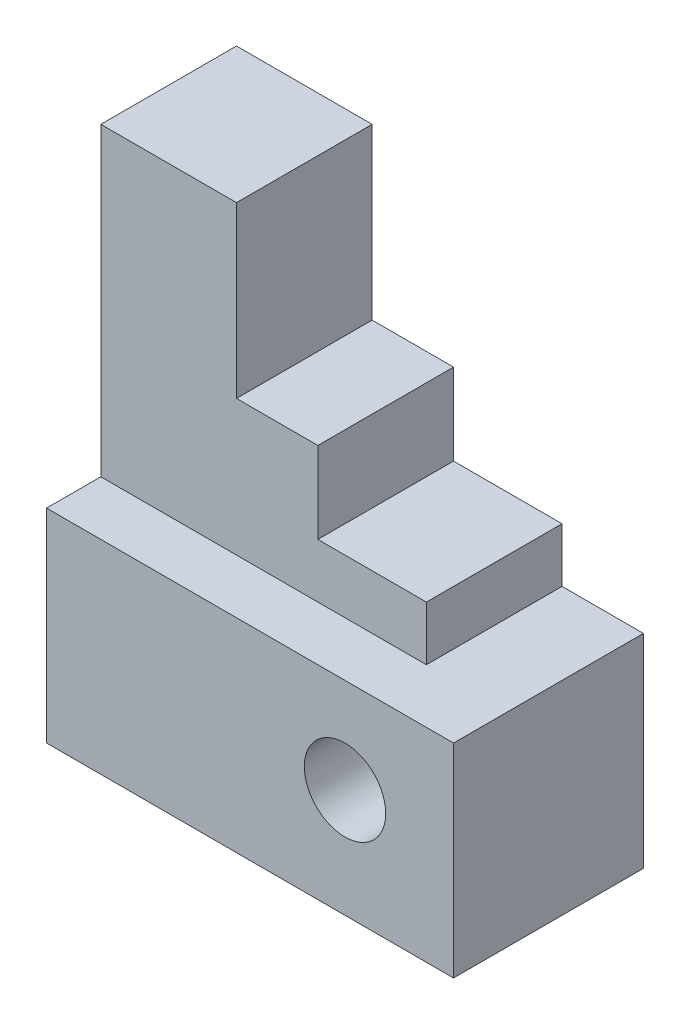
ISO-10303-21;
HEADER;
FILE_DESCRIPTION(('STEP AP214'),'2;1');
FILE_NAME('part.step','',(''),(''),'','','');
FILE_SCHEMA(('AUTOMOTIVE_DESIGN { 1 0 10303 214 1 1 1 1 }'));
ENDSEC;
DATA;
#1=APPLICATION_CONTEXT('core data for automotive mechanical design processes');
#2=APPLICATION_PROTOCOL_DEFINITION('international standard','automotive_design',2000,#1);
#3=PRODUCT_CONTEXT('',#1,'mechanical');
#4=PRODUCT('Part','Part','',(#3));
#5=PRODUCT_RELATED_PRODUCT_CATEGORY('part','',(#4));
#6=PRODUCT_DEFINITION_FORMATION('','',#4);
#7=PRODUCT_DEFINITION_CONTEXT('part definition',#1,'design');
#8=PRODUCT_DEFINITION('design','',#6,#7);
#9=PRODUCT_DEFINITION_SHAPE('','',#8);
#10=(LENGTH_UNIT() NAMED_UNIT(*) SI_UNIT(.MILLI.,.METRE.));
#11=(NAMED_UNIT(*) PLANE_ANGLE_UNIT() SI_UNIT($,.RADIAN.));
#12=(NAMED_UNIT(*) SI_UNIT($,.STERADIAN.) SOLID_ANGLE_UNIT());
#13=UNCERTAINTY_MEASURE_WITH_UNIT(LENGTH_MEASURE(1.E-05),#10,'distance_accuracy_value','');
#14=(GEOMETRIC_REPRESENTATION_CONTEXT(3) GLOBAL_UNCERTAINTY_ASSIGNED_CONTEXT((#13)) GLOBAL_UNIT_ASSIGNED_CONTEXT((#10,
#11,#12)) REPRESENTATION_CONTEXT('',''));
#15=CARTESIAN_POINT('',(0.,0.,0.));
#16=DIRECTION('',(0.,0.,1.));
#17=DIRECTION('',(1.,0.,0.));
#18=AXIS2_PLACEMENT_3D('',#15,#16,#17);
#19=CARTESIAN_POINT('',(0.,0.,14.));
#20=DIRECTION('',(0.,0.,-1.));
#21=DIRECTION('',(-1.,0.,0.));
#22=AXIS2_PLACEMENT_3D('',#19,#20,#21);
#23=PLANE('',#22);
#24=CARTESIAN_POINT('',(44.,16.,14.));
#25=DIRECTION('',(0.,0.,1.));
#26=DIRECTION('',(1.,0.,0.));
#27=AXIS2_PLACEMENT_3D('',#24,#25,#26);
#28=CIRCLE('',#27,6.);
#29=CARTESIAN_POINT('',(50.,16.,14.));
#30=VERTEX_POINT('',#29);
#31=EDGE_CURVE('E184',#30,#30,#28,.T.);
#32=ORIENTED_EDGE('',*,*,#31,.F.);
#33=EDGE_LOOP('',(#32));
#34=FACE_BOUND('',#33,.T.);
#35=DIRECTION('',(1.,0.,0.));
#36=VECTOR('',#35,1.);
#37=CARTESIAN_POINT('',(0.,30.,14.));
#38=LINE('',#37,#36);
#39=CARTESIAN_POINT('',(0.,30.,14.));
#40=VERTEX_POINT('',#39);
#41=CARTESIAN_POINT('',(60.,30.,14.));
#42=VERTEX_POINT('',#41);
#43=EDGE_CURVE('E183',#40,#42,#38,.T.);
#44=ORIENTED_EDGE('',*,*,#43,.F.);
#45=DIRECTION('',(0.,-1.,0.));
#46=VECTOR('',#45,1.);
#47=CARTESIAN_POINT('',(0.,0.,14.));
#48=LINE('',#47,#46);
#49=CARTESIAN_POINT('',(0.,0.,14.));
#50=VERTEX_POINT('',#49);
#51=EDGE_CURVE('E164',#40,#50,#48,.T.);
#52=ORIENTED_EDGE('',*,*,#51,.T.);
#53=DIRECTION('',(1.,0.,0.));
#54=VECTOR('',#53,1.);
#55=CARTESIAN_POINT('',(0.,0.,14.));
#56=LINE('',#55,#54);
#57=CARTESIAN_POINT('',(60.,0.,14.));
#58=VERTEX_POINT('',#57);
#59=EDGE_CURVE('E153',#50,#58,#56,.T.);
#60=ORIENTED_EDGE('',*,*,#59,.T.);
#61=DIRECTION('',(0.,1.,0.));
#62=VECTOR('',#61,1.);
#63=CARTESIAN_POINT('',(60.,0.,14.));
#64=LINE('',#63,#62);
#65=EDGE_CURVE('E147',#58,#42,#64,.T.);
#66=ORIENTED_EDGE('',*,*,#65,.T.);
#67=EDGE_LOOP('',(#44,#52,#60,#66));
#68=FACE_BOUND('',#67,.T.);
#69=ADVANCED_FACE('F45',(#34,#68),#23,.F.);
#70=CARTESIAN_POINT('',(0.,0.,14.));
#71=DIRECTION('',(1.,0.,0.));
#72=DIRECTION('',(0.,0.,-1.));
#73=AXIS2_PLACEMENT_3D('',#70,#71,#72);
#74=PLANE('',#73);
#75=DIRECTION('',(0.,0.,1.));
#76=VECTOR('',#75,1.);
#77=CARTESIAN_POINT('',(0.,30.,14.));
#78=LINE('',#77,#76);
#79=CARTESIAN_POINT('',(0.,30.,6.));
#80=VERTEX_POINT('',#79);
#81=EDGE_CURVE('E142',#80,#40,#78,.T.);
#82=ORIENTED_EDGE('',*,*,#81,.F.);
#83=DIRECTION('',(0.,-1.,0.));
#84=VECTOR('',#83,1.);
#85=CARTESIAN_POINT('',(0.,75.,6.));
#86=LINE('',#85,#84);
#87=CARTESIAN_POINT('',(0.,75.,6.));
#88=VERTEX_POINT('',#87);
#89=EDGE_CURVE('E129',#88,#80,#86,.T.);
#90=ORIENTED_EDGE('',*,*,#89,.F.);
#91=DIRECTION('',(0.,0.,-1.));
#92=VECTOR('',#91,1.);
#93=CARTESIAN_POINT('',(0.,75.,14.));
#94=LINE('',#93,#92);
#95=CARTESIAN_POINT('',(0.,75.,-14.));
#96=VERTEX_POINT('',#95);
#97=EDGE_CURVE('E136',#88,#96,#94,.T.);
#98=ORIENTED_EDGE('',*,*,#97,.T.);
#99=DIRECTION('',(0.,-1.,0.));
#100=VECTOR('',#99,1.);
#101=CARTESIAN_POINT('',(0.,0.,-14.));
#102=LINE('',#101,#100);
#103=CARTESIAN_POINT('',(0.,0.,-14.));
#104=VERTEX_POINT('',#103);
#105=EDGE_CURVE('E168',#96,#104,#102,.T.);
#106=ORIENTED_EDGE('',*,*,#105,.T.);
#107=DIRECTION('',(0.,0.,-1.));
#108=VECTOR('',#107,1.);
#109=CARTESIAN_POINT('',(0.,0.,14.));
#110=LINE('',#109,#108);
#111=EDGE_CURVE('E49',#50,#104,#110,.T.);
#112=ORIENTED_EDGE('',*,*,#111,.F.);
#113=ORIENTED_EDGE('',*,*,#51,.F.);
#114=EDGE_LOOP('',(#82,#90,#98,#106,#112,#113));
#115=FACE_BOUND('',#114,.T.);
#116=ADVANCED_FACE('F42',(#115),#74,.F.);
#117=CARTESIAN_POINT('',(0.,75.,14.));
#118=DIRECTION('',(0.,-1.,0.));
#119=DIRECTION('',(0.,0.,-1.));
#120=AXIS2_PLACEMENT_3D('',#117,#118,#119);
#121=PLANE('',#120);
#122=ORIENTED_EDGE('',*,*,#97,.F.);
#123=DIRECTION('',(1.,0.,0.));
#124=VECTOR('',#123,1.);
#125=CARTESIAN_POINT('',(0.,75.,6.));
#126=LINE('',#125,#124);
#127=CARTESIAN_POINT('',(20.,75.,6.));
#128=VERTEX_POINT('',#127);
#129=EDGE_CURVE('E121',#88,#128,#126,.T.);
#130=ORIENTED_EDGE('',*,*,#129,.T.);
#131=DIRECTION('',(0.,0.,1.));
#132=VECTOR('',#131,1.);
#133=CARTESIAN_POINT('',(20.,75.,-14.));
#134=LINE('',#133,#132);
#135=CARTESIAN_POINT('',(20.,75.,-14.));
#136=VERTEX_POINT('',#135);
#137=EDGE_CURVE('E189',#136,#128,#134,.T.);
#138=ORIENTED_EDGE('',*,*,#137,.F.);
#139=DIRECTION('',(-1.,0.,0.));
#140=VECTOR('',#139,1.);
#141=CARTESIAN_POINT('',(0.,75.,-14.));
#142=LINE('',#141,#140);
#143=EDGE_CURVE('E143',#136,#96,#142,.T.);
#144=ORIENTED_EDGE('',*,*,#143,.T.);
#145=EDGE_LOOP('',(#122,#130,#138,#144));
#146=FACE_BOUND('',#145,.T.);
#147=ADVANCED_FACE('F141',(#146),#121,.F.);
#148=CARTESIAN_POINT('',(0.,0.,-14.));
#149=DIRECTION('',(0.,0.,-1.));
#150=DIRECTION('',(-1.,0.,0.));
#151=AXIS2_PLACEMENT_3D('',#148,#149,#150);
#152=PLANE('',#151);
#153=DIRECTION('',(0.,-1.,0.));
#154=VECTOR('',#153,1.);
#155=CARTESIAN_POINT('',(48.,0.,-14.));
#156=LINE('',#155,#154);
#157=CARTESIAN_POINT('',(48.,38.,-14.));
#158=VERTEX_POINT('',#157);
#159=CARTESIAN_POINT('',(48.,30.,-14.));
#160=VERTEX_POINT('',#159);
#161=EDGE_CURVE('E206',#158,#160,#156,.T.);
#162=ORIENTED_EDGE('',*,*,#161,.T.);
#163=DIRECTION('',(1.,0.,0.));
#164=VECTOR('',#163,1.);
#165=CARTESIAN_POINT('',(0.,30.,-14.));
#166=LINE('',#165,#164);
#167=CARTESIAN_POINT('',(60.,30.,-14.));
#168=VERTEX_POINT('',#167);
#169=EDGE_CURVE('E193',#160,#168,#166,.T.);
#170=ORIENTED_EDGE('',*,*,#169,.T.);
#171=DIRECTION('',(0.,1.,0.));
#172=VECTOR('',#171,1.);
#173=CARTESIAN_POINT('',(60.,0.,-14.));
#174=LINE('',#173,#172);
#175=CARTESIAN_POINT('',(60.,0.,-14.));
#176=VERTEX_POINT('',#175);
#177=EDGE_CURVE('E176',#176,#168,#174,.T.);
#178=ORIENTED_EDGE('',*,*,#177,.F.);
#179=DIRECTION('',(1.,0.,0.));
#180=VECTOR('',#179,1.);
#181=CARTESIAN_POINT('',(0.,0.,-14.));
#182=LINE('',#181,#180);
#183=EDGE_CURVE('E165',#104,#176,#182,.T.);
#184=ORIENTED_EDGE('',*,*,#183,.F.);
#185=ORIENTED_EDGE('',*,*,#105,.F.);
#186=ORIENTED_EDGE('',*,*,#143,.F.);
#187=DIRECTION('',(0.,-1.,0.));
#188=VECTOR('',#187,1.);
#189=CARTESIAN_POINT('',(20.,0.,-14.));
#190=LINE('',#189,#188);
#191=CARTESIAN_POINT('',(20.,50.,-14.));
#192=VERTEX_POINT('',#191);
#193=EDGE_CURVE('E220',#136,#192,#190,.T.);
#194=ORIENTED_EDGE('',*,*,#193,.T.);
#195=DIRECTION('',(1.,0.,0.));
#196=VECTOR('',#195,1.);
#197=CARTESIAN_POINT('',(0.,50.,-14.));
#198=LINE('',#197,#196);
#199=CARTESIAN_POINT('',(32.,50.,-14.));
#200=VERTEX_POINT('',#199);
#201=EDGE_CURVE('E215',#192,#200,#198,.T.);
#202=ORIENTED_EDGE('',*,*,#201,.T.);
#203=DIRECTION('',(0.,-1.,0.));
#204=VECTOR('',#203,1.);
#205=CARTESIAN_POINT('',(32.,0.,-14.));
#206=LINE('',#205,#204);
#207=CARTESIAN_POINT('',(32.,38.,-14.));
#208=VERTEX_POINT('',#207);
#209=EDGE_CURVE('E65',#200,#208,#206,.T.);
#210=ORIENTED_EDGE('',*,*,#209,.T.);
#211=DIRECTION('',(1.,0.,0.));
#212=VECTOR('',#211,1.);
#213=CARTESIAN_POINT('',(0.,38.,-14.));
#214=LINE('',#213,#212);
#215=EDGE_CURVE('E208',#208,#158,#214,.T.);
#216=ORIENTED_EDGE('',*,*,#215,.T.);
#217=EDGE_LOOP('',(#162,#170,#178,#184,#185,#186,#194,#202,#210,#216));
#218=FACE_BOUND('',#217,.T.);
#219=CARTESIAN_POINT('',(44.,16.,-14.));
#220=DIRECTION('',(0.,0.,1.));
#221=DIRECTION('',(1.,0.,0.));
#222=AXIS2_PLACEMENT_3D('',#219,#220,#221);
#223=CIRCLE('',#222,6.);
#224=CARTESIAN_POINT('',(50.,16.,-14.));
#225=VERTEX_POINT('',#224);
#226=EDGE_CURVE('E181',#225,#225,#223,.T.);
#227=ORIENTED_EDGE('',*,*,#226,.T.);
#228=EDGE_LOOP('',(#227));
#229=FACE_BOUND('',#228,.T.);
#230=ADVANCED_FACE('F175',(#218,#229),#152,.T.);
#231=CARTESIAN_POINT('',(0.,0.,14.));
#232=DIRECTION('',(0.,1.,0.));
#233=DIRECTION('',(0.,0.,1.));
#234=AXIS2_PLACEMENT_3D('',#231,#232,#233);
#235=PLANE('',#234);
#236=ORIENTED_EDGE('',*,*,#183,.T.);
#237=DIRECTION('',(0.,0.,-1.));
#238=VECTOR('',#237,1.);
#239=CARTESIAN_POINT('',(60.,0.,14.));
#240=LINE('',#239,#238);
#241=EDGE_CURVE('E149',#58,#176,#240,.T.);
#242=ORIENTED_EDGE('',*,*,#241,.F.);
#243=ORIENTED_EDGE('',*,*,#59,.F.);
#244=ORIENTED_EDGE('',*,*,#111,.T.);
#245=EDGE_LOOP('',(#236,#242,#243,#244));
#246=FACE_BOUND('',#245,.T.);
#247=ADVANCED_FACE('F163',(#246),#235,.F.);
#248=CARTESIAN_POINT('',(60.,0.,14.));
#249=DIRECTION('',(-1.,0.,0.));
#250=DIRECTION('',(0.,0.,1.));
#251=AXIS2_PLACEMENT_3D('',#248,#249,#250);
#252=PLANE('',#251);
#253=ORIENTED_EDGE('',*,*,#177,.T.);
#254=DIRECTION('',(0.,0.,1.));
#255=VECTOR('',#254,1.);
#256=CARTESIAN_POINT('',(60.,30.,-14.));
#257=LINE('',#256,#255);
#258=EDGE_CURVE('E166',#168,#42,#257,.T.);
#259=ORIENTED_EDGE('',*,*,#258,.T.);
#260=ORIENTED_EDGE('',*,*,#65,.F.);
#261=ORIENTED_EDGE('',*,*,#241,.T.);
#262=EDGE_LOOP('',(#253,#259,#260,#261));
#263=FACE_BOUND('',#262,.T.);
#264=ADVANCED_FACE('F267',(#263),#252,.F.);
#265=CARTESIAN_POINT('',(44.,16.,-14.));
#266=DIRECTION('',(0.,0.,1.));
#267=DIRECTION('',(1.,0.,0.));
#268=AXIS2_PLACEMENT_3D('',#265,#266,#267);
#269=CYLINDRICAL_SURFACE('',#268,6.);
#270=ORIENTED_EDGE('',*,*,#226,.F.);
#271=EDGE_LOOP('',(#270));
#272=FACE_BOUND('',#271,.T.);
#273=ORIENTED_EDGE('',*,*,#31,.T.);
#274=EDGE_LOOP('',(#273));
#275=FACE_BOUND('',#274,.T.);
#276=ADVANCED_FACE('F261',(#272,#275),#269,.F.);
#277=CARTESIAN_POINT('',(0.,30.,-14.));
#278=DIRECTION('',(0.,-1.,0.));
#279=DIRECTION('',(0.,0.,-1.));
#280=AXIS2_PLACEMENT_3D('',#277,#278,#279);
#281=PLANE('',#280);
#282=ORIENTED_EDGE('',*,*,#258,.F.);
#283=ORIENTED_EDGE('',*,*,#169,.F.);
#284=DIRECTION('',(0.,0.,1.));
#285=VECTOR('',#284,1.);
#286=CARTESIAN_POINT('',(48.,30.,-14.));
#287=LINE('',#286,#285);
#288=CARTESIAN_POINT('',(48.,30.,6.));
#289=VERTEX_POINT('',#288);
#290=EDGE_CURVE('E201',#160,#289,#287,.T.);
#291=ORIENTED_EDGE('',*,*,#290,.T.);
#292=DIRECTION('',(1.,0.,0.));
#293=VECTOR('',#292,1.);
#294=CARTESIAN_POINT('',(0.,30.,6.));
#295=LINE('',#294,#293);
#296=EDGE_CURVE('E134',#80,#289,#295,.T.);
#297=ORIENTED_EDGE('',*,*,#296,.F.);
#298=ORIENTED_EDGE('',*,*,#81,.T.);
#299=ORIENTED_EDGE('',*,*,#43,.T.);
#300=EDGE_LOOP('',(#282,#283,#291,#297,#298,#299));
#301=FACE_BOUND('',#300,.T.);
#302=ADVANCED_FACE('F236',(#301),#281,.F.);
#303=CARTESIAN_POINT('',(48.,0.,-14.));
#304=DIRECTION('',(-1.,0.,0.));
#305=DIRECTION('',(0.,0.,1.));
#306=AXIS2_PLACEMENT_3D('',#303,#304,#305);
#307=PLANE('',#306);
#308=DIRECTION('',(0.,0.,1.));
#309=VECTOR('',#308,1.);
#310=CARTESIAN_POINT('',(48.,38.,-14.));
#311=LINE('',#310,#309);
#312=CARTESIAN_POINT('',(48.,38.,6.));
#313=VERTEX_POINT('',#312);
#314=EDGE_CURVE('E199',#158,#313,#311,.T.);
#315=ORIENTED_EDGE('',*,*,#314,.T.);
#316=DIRECTION('',(0.,-1.,0.));
#317=VECTOR('',#316,1.);
#318=CARTESIAN_POINT('',(48.,75.,6.));
#319=LINE('',#318,#317);
#320=EDGE_CURVE('E133',#313,#289,#319,.T.);
#321=ORIENTED_EDGE('',*,*,#320,.T.);
#322=ORIENTED_EDGE('',*,*,#290,.F.);
#323=ORIENTED_EDGE('',*,*,#161,.F.);
#324=EDGE_LOOP('',(#315,#321,#322,#323));
#325=FACE_BOUND('',#324,.T.);
#326=ADVANCED_FACE('F231',(#325),#307,.F.);
#327=CARTESIAN_POINT('',(0.,38.,-14.));
#328=DIRECTION('',(0.,-1.,0.));
#329=DIRECTION('',(0.,0.,-1.));
#330=AXIS2_PLACEMENT_3D('',#327,#328,#329);
#331=PLANE('',#330);
#332=DIRECTION('',(0.,0.,1.));
#333=VECTOR('',#332,1.);
#334=CARTESIAN_POINT('',(32.,38.,-14.));
#335=LINE('',#334,#333);
#336=CARTESIAN_POINT('',(32.,38.,6.));
#337=VERTEX_POINT('',#336);
#338=EDGE_CURVE('E197',#208,#337,#335,.T.);
#339=ORIENTED_EDGE('',*,*,#338,.T.);
#340=DIRECTION('',(1.,0.,0.));
#341=VECTOR('',#340,1.);
#342=CARTESIAN_POINT('',(0.,38.,6.));
#343=LINE('',#342,#341);
#344=EDGE_CURVE('E221',#337,#313,#343,.T.);
#345=ORIENTED_EDGE('',*,*,#344,.T.);
#346=ORIENTED_EDGE('',*,*,#314,.F.);
#347=ORIENTED_EDGE('',*,*,#215,.F.);
#348=EDGE_LOOP('',(#339,#345,#346,#347));
#349=FACE_BOUND('',#348,.T.);
#350=ADVANCED_FACE('F237',(#349),#331,.F.);
#351=CARTESIAN_POINT('',(32.,0.,-14.));
#352=DIRECTION('',(-1.,0.,0.));
#353=DIRECTION('',(0.,-1.,0.));
#354=AXIS2_PLACEMENT_3D('',#351,#352,#353);
#355=PLANE('',#354);
#356=DIRECTION('',(0.,0.,1.));
#357=VECTOR('',#356,1.);
#358=CARTESIAN_POINT('',(32.,50.,-14.));
#359=LINE('',#358,#357);
#360=CARTESIAN_POINT('',(32.,50.,6.));
#361=VERTEX_POINT('',#360);
#362=EDGE_CURVE('E195',#200,#361,#359,.T.);
#363=ORIENTED_EDGE('',*,*,#362,.T.);
#364=DIRECTION('',(0.,-1.,0.));
#365=VECTOR('',#364,1.);
#366=CARTESIAN_POINT('',(32.,0.,6.));
#367=LINE('',#366,#365);
#368=EDGE_CURVE('E222',#361,#337,#367,.T.);
#369=ORIENTED_EDGE('',*,*,#368,.T.);
#370=ORIENTED_EDGE('',*,*,#338,.F.);
#371=ORIENTED_EDGE('',*,*,#209,.F.);
#372=EDGE_LOOP('',(#363,#369,#370,#371));
#373=FACE_BOUND('',#372,.T.);
#374=ADVANCED_FACE('F239',(#373),#355,.F.);
#375=CARTESIAN_POINT('',(0.,50.,-14.));
#376=DIRECTION('',(0.,-1.,0.));
#377=DIRECTION('',(0.,0.,-1.));
#378=AXIS2_PLACEMENT_3D('',#375,#376,#377);
#379=PLANE('',#378);
#380=DIRECTION('',(0.,0.,1.));
#381=VECTOR('',#380,1.);
#382=CARTESIAN_POINT('',(20.,50.,-14.));
#383=LINE('',#382,#381);
#384=CARTESIAN_POINT('',(20.,50.,6.));
#385=VERTEX_POINT('',#384);
#386=EDGE_CURVE('E188',#192,#385,#383,.T.);
#387=ORIENTED_EDGE('',*,*,#386,.T.);
#388=DIRECTION('',(1.,0.,0.));
#389=VECTOR('',#388,1.);
#390=CARTESIAN_POINT('',(0.,50.,6.));
#391=LINE('',#390,#389);
#392=EDGE_CURVE('E60',#385,#361,#391,.T.);
#393=ORIENTED_EDGE('',*,*,#392,.T.);
#394=ORIENTED_EDGE('',*,*,#362,.F.);
#395=ORIENTED_EDGE('',*,*,#201,.F.);
#396=EDGE_LOOP('',(#387,#393,#394,#395));
#397=FACE_BOUND('',#396,.T.);
#398=ADVANCED_FACE('F243',(#397),#379,.F.);
#399=CARTESIAN_POINT('',(20.,0.,-14.));
#400=DIRECTION('',(-1.,0.,0.));
#401=DIRECTION('',(0.,0.,1.));
#402=AXIS2_PLACEMENT_3D('',#399,#400,#401);
#403=PLANE('',#402);
#404=ORIENTED_EDGE('',*,*,#137,.T.);
#405=DIRECTION('',(0.,-1.,0.));
#406=VECTOR('',#405,1.);
#407=CARTESIAN_POINT('',(20.,0.,6.));
#408=LINE('',#407,#406);
#409=EDGE_CURVE('E12',#128,#385,#408,.T.);
#410=ORIENTED_EDGE('',*,*,#409,.T.);
#411=ORIENTED_EDGE('',*,*,#386,.F.);
#412=ORIENTED_EDGE('',*,*,#193,.F.);
#413=EDGE_LOOP('',(#404,#410,#411,#412));
#414=FACE_BOUND('',#413,.T.);
#415=ADVANCED_FACE('F244',(#414),#403,.F.);
#416=CARTESIAN_POINT('',(0.,75.,6.));
#417=DIRECTION('',(0.,0.,-1.));
#418=DIRECTION('',(-1.,0.,0.));
#419=AXIS2_PLACEMENT_3D('',#416,#417,#418);
#420=PLANE('',#419);
#421=ORIENTED_EDGE('',*,*,#368,.F.);
#422=ORIENTED_EDGE('',*,*,#392,.F.);
#423=ORIENTED_EDGE('',*,*,#409,.F.);
#424=ORIENTED_EDGE('',*,*,#129,.F.);
#425=ORIENTED_EDGE('',*,*,#89,.T.);
#426=ORIENTED_EDGE('',*,*,#296,.T.);
#427=ORIENTED_EDGE('',*,*,#320,.F.);
#428=ORIENTED_EDGE('',*,*,#344,.F.);
#429=EDGE_LOOP('',(#421,#422,#423,#424,#425,#426,#427,#428));
#430=FACE_BOUND('',#429,.T.);
#431=ADVANCED_FACE('F128',(#430),#420,.F.);
#432=CLOSED_SHELL('',(#69,#116,#147,#230,#247,#264,#276,#302,#326,#350,#374,#398,#415,#431));
#433=MANIFOLD_SOLID_BREP('B2',#432);
#434=ADVANCED_BREP_SHAPE_REPRESENTATION('',(#18,#433),#14);
#435=SHAPE_DEFINITION_REPRESENTATION(#9,#434);
ENDSEC;
END-ISO-10303-21;
